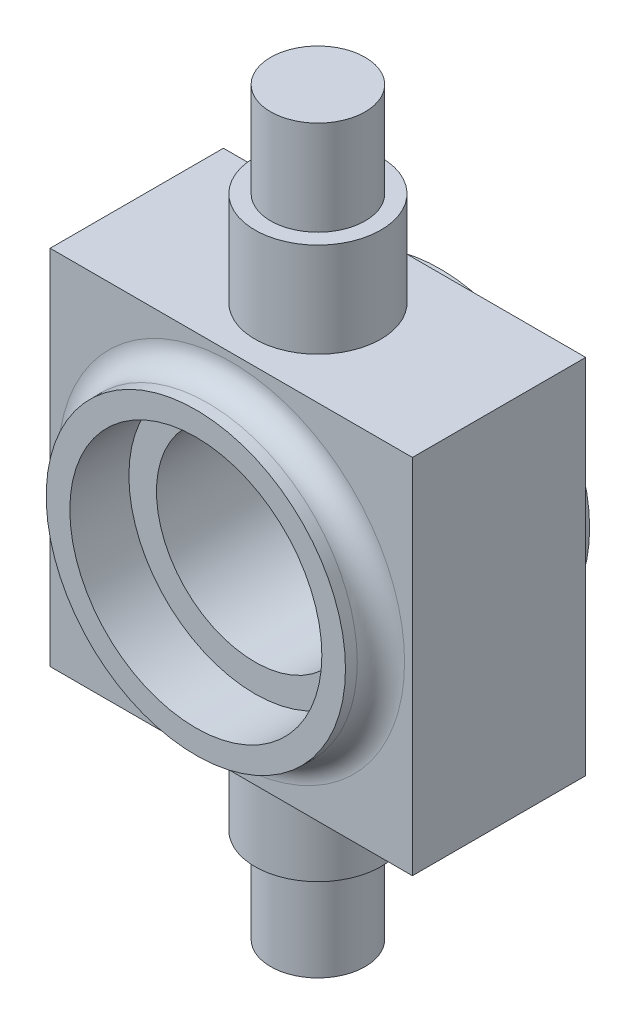
ISO-10303-21;
HEADER;
FILE_DESCRIPTION(('STEP AP214'),'2;1');
FILE_NAME('part.step','',(''),(''),'','','');
FILE_SCHEMA(('AUTOMOTIVE_DESIGN { 1 0 10303 214 1 1 1 1 }'));
ENDSEC;
DATA;
#1=APPLICATION_CONTEXT('core data for automotive mechanical design processes');
#2=APPLICATION_PROTOCOL_DEFINITION('international standard','automotive_design',2000,#1);
#3=PRODUCT_CONTEXT('',#1,'mechanical');
#4=PRODUCT('Part','Part','',(#3));
#5=PRODUCT_RELATED_PRODUCT_CATEGORY('part','',(#4));
#6=PRODUCT_DEFINITION_FORMATION('','',#4);
#7=PRODUCT_DEFINITION_CONTEXT('part definition',#1,'design');
#8=PRODUCT_DEFINITION('design','',#6,#7);
#9=PRODUCT_DEFINITION_SHAPE('','',#8);
#10=(LENGTH_UNIT() NAMED_UNIT(*) SI_UNIT(.MILLI.,.METRE.));
#11=(NAMED_UNIT(*) PLANE_ANGLE_UNIT() SI_UNIT($,.RADIAN.));
#12=(NAMED_UNIT(*) SI_UNIT($,.STERADIAN.) SOLID_ANGLE_UNIT());
#13=UNCERTAINTY_MEASURE_WITH_UNIT(LENGTH_MEASURE(1.E-05),#10,'distance_accuracy_value','');
#14=(GEOMETRIC_REPRESENTATION_CONTEXT(3) GLOBAL_UNCERTAINTY_ASSIGNED_CONTEXT((#13)) GLOBAL_UNIT_ASSIGNED_CONTEXT((#10,
#11,#12)) REPRESENTATION_CONTEXT('',''));
#15=CARTESIAN_POINT('',(0.,0.,0.));
#16=DIRECTION('',(0.,0.,1.));
#17=DIRECTION('',(1.,0.,0.));
#18=AXIS2_PLACEMENT_3D('',#15,#16,#17);
#19=CARTESIAN_POINT('',(0.,0.,-11.));
#20=DIRECTION('',(0.,0.,1.));
#21=DIRECTION('',(1.,0.,0.));
#22=AXIS2_PLACEMENT_3D('',#19,#20,#21);
#23=CYLINDRICAL_SURFACE('',#22,12.5);
#24=CARTESIAN_POINT('',(0.,0.,8.));
#25=DIRECTION('',(0.,0.,1.));
#26=DIRECTION('',(1.,0.,0.));
#27=AXIS2_PLACEMENT_3D('',#24,#25,#26);
#28=CIRCLE('',#27,12.5);
#29=CARTESIAN_POINT('',(12.5,0.,8.));
#30=VERTEX_POINT('',#29);
#31=EDGE_CURVE('E910',#30,#30,#28,.T.);
#32=ORIENTED_EDGE('',*,*,#31,.T.);
#33=EDGE_LOOP('',(#32));
#34=FACE_BOUND('',#33,.T.);
#35=CARTESIAN_POINT('',(0.,0.,-8.));
#36=DIRECTION('',(0.,0.,-1.));
#37=DIRECTION('',(-1.,0.,0.));
#38=AXIS2_PLACEMENT_3D('',#35,#36,#37);
#39=CIRCLE('',#38,12.5);
#40=CARTESIAN_POINT('',(-12.5,0.,-8.));
#41=VERTEX_POINT('',#40);
#42=EDGE_CURVE('E776',#41,#41,#39,.F.);
#43=ORIENTED_EDGE('',*,*,#42,.F.);
#44=EDGE_LOOP('',(#43));
#45=FACE_BOUND('',#44,.T.);
#46=ADVANCED_FACE('F688',(#34,#45),#23,.F.);
#47=CARTESIAN_POINT('',(23.,23.,11.));
#48=DIRECTION('',(-1.,0.,0.));
#49=DIRECTION('',(0.,-1.,0.));
#50=AXIS2_PLACEMENT_3D('',#47,#48,#49);
#51=PLANE('',#50);
#52=DIRECTION('',(0.,1.,0.));
#53=VECTOR('',#52,1.);
#54=CARTESIAN_POINT('',(23.,23.,-11.));
#55=LINE('',#54,#53);
#56=CARTESIAN_POINT('',(23.,-23.,-11.));
#57=VERTEX_POINT('',#56);
#58=CARTESIAN_POINT('',(23.,23.,-11.));
#59=VERTEX_POINT('',#58);
#60=EDGE_CURVE('E761',#57,#59,#55,.T.);
#61=ORIENTED_EDGE('',*,*,#60,.T.);
#62=DIRECTION('',(0.,0.,-1.));
#63=VECTOR('',#62,1.);
#64=CARTESIAN_POINT('',(23.,23.,11.));
#65=LINE('',#64,#63);
#66=CARTESIAN_POINT('',(23.,23.,11.));
#67=VERTEX_POINT('',#66);
#68=EDGE_CURVE('E750',#67,#59,#65,.T.);
#69=ORIENTED_EDGE('',*,*,#68,.F.);
#70=DIRECTION('',(0.,1.,0.));
#71=VECTOR('',#70,1.);
#72=CARTESIAN_POINT('',(23.,23.,11.));
#73=LINE('',#72,#71);
#74=CARTESIAN_POINT('',(23.,-23.,11.));
#75=VERTEX_POINT('',#74);
#76=EDGE_CURVE('E744',#75,#67,#73,.T.);
#77=ORIENTED_EDGE('',*,*,#76,.F.);
#78=DIRECTION('',(0.,0.,-1.));
#79=VECTOR('',#78,1.);
#80=CARTESIAN_POINT('',(23.,-23.,11.));
#81=LINE('',#80,#79);
#82=EDGE_CURVE('E760',#75,#57,#81,.T.);
#83=ORIENTED_EDGE('',*,*,#82,.T.);
#84=EDGE_LOOP('',(#61,#69,#77,#83));
#85=FACE_BOUND('',#84,.T.);
#86=ADVANCED_FACE('F821',(#85),#51,.F.);
#87=CARTESIAN_POINT('',(-23.,23.,11.));
#88=DIRECTION('',(0.,-1.,0.));
#89=DIRECTION('',(0.,0.,-1.));
#90=AXIS2_PLACEMENT_3D('',#87,#88,#89);
#91=PLANE('',#90);
#92=CARTESIAN_POINT('',(0.,23.,0.));
#93=DIRECTION('',(0.,-1.,0.));
#94=DIRECTION('',(0.,0.,-1.));
#95=AXIS2_PLACEMENT_3D('',#92,#93,#94);
#96=CIRCLE('',#95,8.);
#97=CARTESIAN_POINT('',(0.,23.,-8.));
#98=VERTEX_POINT('',#97);
#99=EDGE_CURVE('E863',#98,#98,#96,.T.);
#100=ORIENTED_EDGE('',*,*,#99,.T.);
#101=EDGE_LOOP('',(#100));
#102=FACE_BOUND('',#101,.T.);
#103=DIRECTION('',(-1.,0.,0.));
#104=VECTOR('',#103,1.);
#105=CARTESIAN_POINT('',(-23.,23.,-11.));
#106=LINE('',#105,#104);
#107=CARTESIAN_POINT('',(-23.,23.,-11.));
#108=VERTEX_POINT('',#107);
#109=EDGE_CURVE('E747',#59,#108,#106,.T.);
#110=ORIENTED_EDGE('',*,*,#109,.T.);
#111=DIRECTION('',(0.,0.,-1.));
#112=VECTOR('',#111,1.);
#113=CARTESIAN_POINT('',(-23.,23.,11.));
#114=LINE('',#113,#112);
#115=CARTESIAN_POINT('',(-23.,23.,11.));
#116=VERTEX_POINT('',#115);
#117=EDGE_CURVE('E742',#116,#108,#114,.T.);
#118=ORIENTED_EDGE('',*,*,#117,.F.);
#119=DIRECTION('',(-1.,0.,0.));
#120=VECTOR('',#119,1.);
#121=CARTESIAN_POINT('',(-23.,23.,11.));
#122=LINE('',#121,#120);
#123=EDGE_CURVE('E739',#67,#116,#122,.T.);
#124=ORIENTED_EDGE('',*,*,#123,.F.);
#125=ORIENTED_EDGE('',*,*,#68,.T.);
#126=EDGE_LOOP('',(#110,#118,#124,#125));
#127=FACE_BOUND('',#126,.T.);
#128=ADVANCED_FACE('F748',(#102,#127),#91,.F.);
#129=CARTESIAN_POINT('',(-23.,23.,11.));
#130=DIRECTION('',(1.,0.,0.));
#131=DIRECTION('',(0.,1.,0.));
#132=AXIS2_PLACEMENT_3D('',#129,#130,#131);
#133=PLANE('',#132);
#134=DIRECTION('',(0.,-1.,0.));
#135=VECTOR('',#134,1.);
#136=CARTESIAN_POINT('',(-23.,23.,-11.));
#137=LINE('',#136,#135);
#138=CARTESIAN_POINT('',(-23.,-23.,-11.));
#139=VERTEX_POINT('',#138);
#140=EDGE_CURVE('E725',#108,#139,#137,.T.);
#141=ORIENTED_EDGE('',*,*,#140,.T.);
#142=DIRECTION('',(0.,0.,-1.));
#143=VECTOR('',#142,1.);
#144=CARTESIAN_POINT('',(-23.,-23.,11.));
#145=LINE('',#144,#143);
#146=CARTESIAN_POINT('',(-23.,-23.,11.));
#147=VERTEX_POINT('',#146);
#148=EDGE_CURVE('E749',#147,#139,#145,.T.);
#149=ORIENTED_EDGE('',*,*,#148,.F.);
#150=DIRECTION('',(0.,-1.,0.));
#151=VECTOR('',#150,1.);
#152=CARTESIAN_POINT('',(-23.,23.,11.));
#153=LINE('',#152,#151);
#154=EDGE_CURVE('E738',#116,#147,#153,.T.);
#155=ORIENTED_EDGE('',*,*,#154,.F.);
#156=ORIENTED_EDGE('',*,*,#117,.T.);
#157=EDGE_LOOP('',(#141,#149,#155,#156));
#158=FACE_BOUND('',#157,.T.);
#159=ADVANCED_FACE('F755',(#158),#133,.F.);
#160=CARTESIAN_POINT('',(-23.,-23.,11.));
#161=DIRECTION('',(0.,1.,0.));
#162=DIRECTION('',(0.,0.,1.));
#163=AXIS2_PLACEMENT_3D('',#160,#161,#162);
#164=PLANE('',#163);
#165=CARTESIAN_POINT('',(0.,-23.,0.));
#166=DIRECTION('',(0.,-1.,0.));
#167=DIRECTION('',(0.,0.,-1.));
#168=AXIS2_PLACEMENT_3D('',#165,#166,#167);
#169=CIRCLE('',#168,8.);
#170=CARTESIAN_POINT('',(0.,-23.,-8.));
#171=VERTEX_POINT('',#170);
#172=EDGE_CURVE('E779',#171,#171,#169,.T.);
#173=ORIENTED_EDGE('',*,*,#172,.F.);
#174=EDGE_LOOP('',(#173));
#175=FACE_BOUND('',#174,.T.);
#176=DIRECTION('',(1.,0.,0.));
#177=VECTOR('',#176,1.);
#178=CARTESIAN_POINT('',(-23.,-23.,-11.));
#179=LINE('',#178,#177);
#180=EDGE_CURVE('E726',#139,#57,#179,.T.);
#181=ORIENTED_EDGE('',*,*,#180,.T.);
#182=ORIENTED_EDGE('',*,*,#82,.F.);
#183=DIRECTION('',(1.,0.,0.));
#184=VECTOR('',#183,1.);
#185=CARTESIAN_POINT('',(-23.,-23.,11.));
#186=LINE('',#185,#184);
#187=EDGE_CURVE('E704',#147,#75,#186,.T.);
#188=ORIENTED_EDGE('',*,*,#187,.F.);
#189=ORIENTED_EDGE('',*,*,#148,.T.);
#190=EDGE_LOOP('',(#181,#182,#188,#189));
#191=FACE_BOUND('',#190,.T.);
#192=ADVANCED_FACE('F850',(#175,#191),#164,.F.);
#193=CARTESIAN_POINT('',(0.,0.,11.));
#194=DIRECTION('',(0.,0.,1.));
#195=DIRECTION('',(1.,0.,0.));
#196=AXIS2_PLACEMENT_3D('',#193,#194,#195);
#197=PLANE('',#196);
#198=CARTESIAN_POINT('',(0.,0.,11.));
#199=DIRECTION('',(0.,0.,1.));
#200=DIRECTION('',(1.,0.,0.));
#201=AXIS2_PLACEMENT_3D('',#198,#199,#200);
#202=CIRCLE('',#201,22.);
#203=CARTESIAN_POINT('',(22.,0.,11.));
#204=VERTEX_POINT('',#203);
#205=EDGE_CURVE('E788',#204,#204,#202,.F.);
#206=ORIENTED_EDGE('',*,*,#205,.T.);
#207=EDGE_LOOP('',(#206));
#208=FACE_BOUND('',#207,.T.);
#209=ORIENTED_EDGE('',*,*,#76,.T.);
#210=ORIENTED_EDGE('',*,*,#123,.T.);
#211=ORIENTED_EDGE('',*,*,#154,.T.);
#212=ORIENTED_EDGE('',*,*,#187,.T.);
#213=EDGE_LOOP('',(#209,#210,#211,#212));
#214=FACE_BOUND('',#213,.T.);
#215=ADVANCED_FACE('F736',(#208,#214),#197,.T.);
#216=CARTESIAN_POINT('',(0.,0.,-11.));
#217=DIRECTION('',(0.,0.,1.));
#218=DIRECTION('',(1.,0.,0.));
#219=AXIS2_PLACEMENT_3D('',#216,#217,#218);
#220=PLANE('',#219);
#221=CARTESIAN_POINT('',(0.,0.,-11.));
#222=DIRECTION('',(0.,0.,1.));
#223=DIRECTION('',(1.,0.,0.));
#224=AXIS2_PLACEMENT_3D('',#221,#222,#223);
#225=CIRCLE('',#224,22.);
#226=CARTESIAN_POINT('',(22.,0.,-11.));
#227=VERTEX_POINT('',#226);
#228=EDGE_CURVE('E795',#227,#227,#225,.T.);
#229=ORIENTED_EDGE('',*,*,#228,.T.);
#230=EDGE_LOOP('',(#229));
#231=FACE_BOUND('',#230,.T.);
#232=ORIENTED_EDGE('',*,*,#60,.F.);
#233=ORIENTED_EDGE('',*,*,#180,.F.);
#234=ORIENTED_EDGE('',*,*,#140,.F.);
#235=ORIENTED_EDGE('',*,*,#109,.F.);
#236=EDGE_LOOP('',(#232,#233,#234,#235));
#237=FACE_BOUND('',#236,.T.);
#238=ADVANCED_FACE('F841',(#231,#237),#220,.F.);
#239=CARTESIAN_POINT('',(0.,0.,8.));
#240=DIRECTION('',(0.,0.,1.));
#241=DIRECTION('',(1.,0.,0.));
#242=AXIS2_PLACEMENT_3D('',#239,#240,#241);
#243=CYLINDRICAL_SURFACE('',#242,16.);
#244=CARTESIAN_POINT('',(0.,0.,8.));
#245=DIRECTION('',(0.,0.,1.));
#246=DIRECTION('',(1.,0.,0.));
#247=AXIS2_PLACEMENT_3D('',#244,#245,#246);
#248=CIRCLE('',#247,16.);
#249=CARTESIAN_POINT('',(16.,0.,8.));
#250=VERTEX_POINT('',#249);
#251=EDGE_CURVE('E764',#250,#250,#248,.T.);
#252=ORIENTED_EDGE('',*,*,#251,.F.);
#253=EDGE_LOOP('',(#252));
#254=FACE_BOUND('',#253,.T.);
#255=CARTESIAN_POINT('',(0.,0.,15.5));
#256=DIRECTION('',(0.,0.,1.));
#257=DIRECTION('',(1.,0.,0.));
#258=AXIS2_PLACEMENT_3D('',#255,#256,#257);
#259=CIRCLE('',#258,16.);
#260=CARTESIAN_POINT('',(16.,0.,15.5));
#261=VERTEX_POINT('',#260);
#262=EDGE_CURVE('E894',#261,#261,#259,.T.);
#263=ORIENTED_EDGE('',*,*,#262,.T.);
#264=EDGE_LOOP('',(#263));
#265=FACE_BOUND('',#264,.T.);
#266=ADVANCED_FACE('F838',(#254,#265),#243,.F.);
#267=CARTESIAN_POINT('',(0.,0.,8.));
#268=DIRECTION('',(0.,0.,1.));
#269=DIRECTION('',(1.,0.,0.));
#270=AXIS2_PLACEMENT_3D('',#267,#268,#269);
#271=PLANE('',#270);
#272=ORIENTED_EDGE('',*,*,#31,.F.);
#273=EDGE_LOOP('',(#272));
#274=FACE_BOUND('',#273,.T.);
#275=ORIENTED_EDGE('',*,*,#251,.T.);
#276=EDGE_LOOP('',(#275));
#277=FACE_BOUND('',#276,.T.);
#278=ADVANCED_FACE('F840',(#274,#277),#271,.T.);
#279=CARTESIAN_POINT('',(0.,-35.,0.));
#280=DIRECTION('',(0.,1.,0.));
#281=DIRECTION('',(0.,0.,1.));
#282=AXIS2_PLACEMENT_3D('',#279,#280,#281);
#283=CYLINDRICAL_SURFACE('',#282,8.);
#284=CARTESIAN_POINT('',(0.,-35.,0.));
#285=DIRECTION('',(0.,-1.,0.));
#286=DIRECTION('',(0.,0.,-1.));
#287=AXIS2_PLACEMENT_3D('',#284,#285,#286);
#288=CIRCLE('',#287,8.);
#289=CARTESIAN_POINT('',(0.,-35.,-8.));
#290=VERTEX_POINT('',#289);
#291=EDGE_CURVE('E904',#290,#290,#288,.T.);
#292=ORIENTED_EDGE('',*,*,#291,.F.);
#293=EDGE_LOOP('',(#292));
#294=FACE_BOUND('',#293,.T.);
#295=ORIENTED_EDGE('',*,*,#172,.T.);
#296=EDGE_LOOP('',(#295));
#297=FACE_BOUND('',#296,.T.);
#298=ADVANCED_FACE('F834',(#294,#297),#283,.T.);
#299=CARTESIAN_POINT('',(0.,-35.,0.));
#300=DIRECTION('',(0.,-1.,0.));
#301=DIRECTION('',(0.,0.,-1.));
#302=AXIS2_PLACEMENT_3D('',#299,#300,#301);
#303=PLANE('',#302);
#304=CARTESIAN_POINT('',(0.,-35.,0.));
#305=DIRECTION('',(0.,-1.,0.));
#306=DIRECTION('',(0.,0.,-1.));
#307=AXIS2_PLACEMENT_3D('',#304,#305,#306);
#308=CIRCLE('',#307,6.);
#309=CARTESIAN_POINT('',(0.,-35.,-6.));
#310=VERTEX_POINT('',#309);
#311=EDGE_CURVE('E12',#310,#310,#308,.T.);
#312=ORIENTED_EDGE('',*,*,#311,.F.);
#313=EDGE_LOOP('',(#312));
#314=FACE_BOUND('',#313,.T.);
#315=ORIENTED_EDGE('',*,*,#291,.T.);
#316=EDGE_LOOP('',(#315));
#317=FACE_BOUND('',#316,.T.);
#318=ADVANCED_FACE('F943',(#314,#317),#303,.T.);
#319=CARTESIAN_POINT('',(0.,0.,15.5));
#320=DIRECTION('',(0.,0.,1.));
#321=DIRECTION('',(1.,0.,0.));
#322=AXIS2_PLACEMENT_3D('',#319,#320,#321);
#323=PLANE('',#322);
#324=ORIENTED_EDGE('',*,*,#262,.F.);
#325=EDGE_LOOP('',(#324));
#326=FACE_BOUND('',#325,.T.);
#327=CARTESIAN_POINT('',(0.,0.,15.5));
#328=DIRECTION('',(0.,0.,1.));
#329=DIRECTION('',(1.,0.,0.));
#330=AXIS2_PLACEMENT_3D('',#327,#328,#329);
#331=CIRCLE('',#330,19.);
#332=CARTESIAN_POINT('',(19.,0.,15.5));
#333=VERTEX_POINT('',#332);
#334=EDGE_CURVE('E898',#333,#333,#331,.T.);
#335=ORIENTED_EDGE('',*,*,#334,.T.);
#336=EDGE_LOOP('',(#335));
#337=FACE_BOUND('',#336,.T.);
#338=ADVANCED_FACE('F940',(#326,#337),#323,.T.);
#339=CARTESIAN_POINT('',(0.,0.,15.5));
#340=DIRECTION('',(0.,0.,-1.));
#341=DIRECTION('',(-1.,0.,0.));
#342=AXIS2_PLACEMENT_3D('',#339,#340,#341);
#343=CYLINDRICAL_SURFACE('',#342,19.);
#344=CARTESIAN_POINT('',(0.,0.,14.));
#345=DIRECTION('',(0.,0.,1.));
#346=DIRECTION('',(1.,0.,0.));
#347=AXIS2_PLACEMENT_3D('',#344,#345,#346);
#348=CIRCLE('',#347,19.);
#349=CARTESIAN_POINT('',(19.,0.,14.));
#350=VERTEX_POINT('',#349);
#351=EDGE_CURVE('E782',#350,#350,#348,.T.);
#352=ORIENTED_EDGE('',*,*,#351,.T.);
#353=EDGE_LOOP('',(#352));
#354=FACE_BOUND('',#353,.T.);
#355=ORIENTED_EDGE('',*,*,#334,.F.);
#356=EDGE_LOOP('',(#355));
#357=FACE_BOUND('',#356,.T.);
#358=ADVANCED_FACE('F937',(#354,#357),#343,.T.);
#359=CARTESIAN_POINT('',(0.,0.,-15.5));
#360=DIRECTION('',(0.,0.,-1.));
#361=DIRECTION('',(1.,0.,0.));
#362=AXIS2_PLACEMENT_3D('',#359,#360,#361);
#363=PLANE('',#362);
#364=CARTESIAN_POINT('',(0.,0.,-15.5));
#365=DIRECTION('',(0.,0.,1.));
#366=DIRECTION('',(1.,0.,0.));
#367=AXIS2_PLACEMENT_3D('',#364,#365,#366);
#368=CIRCLE('',#367,16.);
#369=CARTESIAN_POINT('',(16.,0.,-15.5));
#370=VERTEX_POINT('',#369);
#371=EDGE_CURVE('E884',#370,#370,#368,.T.);
#372=ORIENTED_EDGE('',*,*,#371,.T.);
#373=EDGE_LOOP('',(#372));
#374=FACE_BOUND('',#373,.T.);
#375=CARTESIAN_POINT('',(0.,0.,-15.5));
#376=DIRECTION('',(0.,0.,1.));
#377=DIRECTION('',(1.,0.,0.));
#378=AXIS2_PLACEMENT_3D('',#375,#376,#377);
#379=CIRCLE('',#378,19.);
#380=CARTESIAN_POINT('',(19.,0.,-15.5));
#381=VERTEX_POINT('',#380);
#382=EDGE_CURVE('E785',#381,#381,#379,.T.);
#383=ORIENTED_EDGE('',*,*,#382,.F.);
#384=EDGE_LOOP('',(#383));
#385=FACE_BOUND('',#384,.T.);
#386=ADVANCED_FACE('F948',(#374,#385),#363,.T.);
#387=CARTESIAN_POINT('',(0.,0.,-15.5));
#388=DIRECTION('',(0.,0.,1.));
#389=DIRECTION('',(1.,0.,0.));
#390=AXIS2_PLACEMENT_3D('',#387,#388,#389);
#391=CYLINDRICAL_SURFACE('',#390,19.);
#392=CARTESIAN_POINT('',(0.,0.,-14.));
#393=DIRECTION('',(0.,0.,1.));
#394=DIRECTION('',(1.,0.,0.));
#395=AXIS2_PLACEMENT_3D('',#392,#393,#394);
#396=CIRCLE('',#395,19.);
#397=CARTESIAN_POINT('',(19.,0.,-14.));
#398=VERTEX_POINT('',#397);
#399=EDGE_CURVE('E687',#398,#398,#396,.F.);
#400=ORIENTED_EDGE('',*,*,#399,.T.);
#401=EDGE_LOOP('',(#400));
#402=FACE_BOUND('',#401,.T.);
#403=ORIENTED_EDGE('',*,*,#382,.T.);
#404=EDGE_LOOP('',(#403));
#405=FACE_BOUND('',#404,.T.);
#406=ADVANCED_FACE('F805',(#402,#405),#391,.T.);
#407=CARTESIAN_POINT('',(0.,0.,-8.));
#408=DIRECTION('',(0.,0.,-1.));
#409=DIRECTION('',(1.,0.,0.));
#410=AXIS2_PLACEMENT_3D('',#407,#408,#409);
#411=PLANE('',#410);
#412=CARTESIAN_POINT('',(0.,0.,-8.));
#413=DIRECTION('',(0.,0.,1.));
#414=DIRECTION('',(1.,0.,0.));
#415=AXIS2_PLACEMENT_3D('',#412,#413,#414);
#416=CIRCLE('',#415,16.);
#417=CARTESIAN_POINT('',(16.,0.,-8.));
#418=VERTEX_POINT('',#417);
#419=EDGE_CURVE('E783',#418,#418,#416,.T.);
#420=ORIENTED_EDGE('',*,*,#419,.F.);
#421=EDGE_LOOP('',(#420));
#422=FACE_BOUND('',#421,.T.);
#423=ORIENTED_EDGE('',*,*,#42,.T.);
#424=EDGE_LOOP('',(#423));
#425=FACE_BOUND('',#424,.T.);
#426=ADVANCED_FACE('F1004',(#422,#425),#411,.T.);
#427=CARTESIAN_POINT('',(0.,0.,-8.));
#428=DIRECTION('',(0.,0.,-1.));
#429=DIRECTION('',(-1.,0.,0.));
#430=AXIS2_PLACEMENT_3D('',#427,#428,#429);
#431=CYLINDRICAL_SURFACE('',#430,16.);
#432=ORIENTED_EDGE('',*,*,#419,.T.);
#433=EDGE_LOOP('',(#432));
#434=FACE_BOUND('',#433,.T.);
#435=ORIENTED_EDGE('',*,*,#371,.F.);
#436=EDGE_LOOP('',(#435));
#437=FACE_BOUND('',#436,.T.);
#438=ADVANCED_FACE('F816',(#434,#437),#431,.F.);
#439=CARTESIAN_POINT('',(0.,0.,14.));
#440=DIRECTION('',(0.,0.,1.));
#441=DIRECTION('',(1.,0.,0.));
#442=AXIS2_PLACEMENT_3D('',#439,#440,#441);
#443=TOROIDAL_SURFACE('',#442,22.,3.);
#444=ORIENTED_EDGE('',*,*,#205,.F.);
#445=EDGE_LOOP('',(#444));
#446=FACE_BOUND('',#445,.T.);
#447=ORIENTED_EDGE('',*,*,#351,.F.);
#448=EDGE_LOOP('',(#447));
#449=FACE_BOUND('',#448,.T.);
#450=ADVANCED_FACE('F808',(#446,#449),#443,.F.);
#451=CARTESIAN_POINT('',(0.,0.,-14.));
#452=DIRECTION('',(0.,0.,1.));
#453=DIRECTION('',(1.,0.,0.));
#454=AXIS2_PLACEMENT_3D('',#451,#452,#453);
#455=TOROIDAL_SURFACE('',#454,22.,3.);
#456=ORIENTED_EDGE('',*,*,#399,.F.);
#457=EDGE_LOOP('',(#456));
#458=FACE_BOUND('',#457,.T.);
#459=ORIENTED_EDGE('',*,*,#228,.F.);
#460=EDGE_LOOP('',(#459));
#461=FACE_BOUND('',#460,.T.);
#462=ADVANCED_FACE('F686',(#458,#461),#455,.F.);
#463=CARTESIAN_POINT('',(0.,-47.,0.));
#464=DIRECTION('',(0.,1.,0.));
#465=DIRECTION('',(0.,0.,1.));
#466=AXIS2_PLACEMENT_3D('',#463,#464,#465);
#467=CYLINDRICAL_SURFACE('',#466,6.);
#468=CARTESIAN_POINT('',(0.,-47.,0.));
#469=DIRECTION('',(0.,-1.,0.));
#470=DIRECTION('',(0.,0.,-1.));
#471=AXIS2_PLACEMENT_3D('',#468,#469,#470);
#472=CIRCLE('',#471,6.);
#473=CARTESIAN_POINT('',(0.,-47.,-6.));
#474=VERTEX_POINT('',#473);
#475=EDGE_CURVE('E872',#474,#474,#472,.T.);
#476=ORIENTED_EDGE('',*,*,#475,.F.);
#477=EDGE_LOOP('',(#476));
#478=FACE_BOUND('',#477,.T.);
#479=ORIENTED_EDGE('',*,*,#311,.T.);
#480=EDGE_LOOP('',(#479));
#481=FACE_BOUND('',#480,.T.);
#482=ADVANCED_FACE('F810',(#478,#481),#467,.T.);
#483=CARTESIAN_POINT('',(0.,-47.,0.));
#484=DIRECTION('',(0.,-1.,0.));
#485=DIRECTION('',(0.,0.,-1.));
#486=AXIS2_PLACEMENT_3D('',#483,#484,#485);
#487=PLANE('',#486);
#488=ORIENTED_EDGE('',*,*,#475,.T.);
#489=EDGE_LOOP('',(#488));
#490=FACE_BOUND('',#489,.T.);
#491=ADVANCED_FACE('F814',(#490),#487,.T.);
#492=CARTESIAN_POINT('',(0.,35.,0.));
#493=DIRECTION('',(0.,-1.,0.));
#494=DIRECTION('',(0.,0.,-1.));
#495=AXIS2_PLACEMENT_3D('',#492,#493,#494);
#496=CYLINDRICAL_SURFACE('',#495,8.);
#497=CARTESIAN_POINT('',(0.,35.,0.));
#498=DIRECTION('',(0.,-1.,0.));
#499=DIRECTION('',(0.,0.,-1.));
#500=AXIS2_PLACEMENT_3D('',#497,#498,#499);
#501=CIRCLE('',#500,8.);
#502=CARTESIAN_POINT('',(0.,35.,-8.));
#503=VERTEX_POINT('',#502);
#504=EDGE_CURVE('E870',#503,#503,#501,.T.);
#505=ORIENTED_EDGE('',*,*,#504,.T.);
#506=EDGE_LOOP('',(#505));
#507=FACE_BOUND('',#506,.T.);
#508=ORIENTED_EDGE('',*,*,#99,.F.);
#509=EDGE_LOOP('',(#508));
#510=FACE_BOUND('',#509,.T.);
#511=ADVANCED_FACE('F1045',(#507,#510),#496,.T.);
#512=CARTESIAN_POINT('',(0.,35.,0.));
#513=DIRECTION('',(0.,1.,0.));
#514=DIRECTION('',(0.,0.,-1.));
#515=AXIS2_PLACEMENT_3D('',#512,#513,#514);
#516=PLANE('',#515);
#517=CARTESIAN_POINT('',(0.,35.,0.));
#518=DIRECTION('',(0.,-1.,0.));
#519=DIRECTION('',(0.,0.,-1.));
#520=AXIS2_PLACEMENT_3D('',#517,#518,#519);
#521=CIRCLE('',#520,6.);
#522=CARTESIAN_POINT('',(0.,35.,-6.));
#523=VERTEX_POINT('',#522);
#524=EDGE_CURVE('E876',#523,#523,#521,.T.);
#525=ORIENTED_EDGE('',*,*,#524,.T.);
#526=EDGE_LOOP('',(#525));
#527=FACE_BOUND('',#526,.T.);
#528=ORIENTED_EDGE('',*,*,#504,.F.);
#529=EDGE_LOOP('',(#528));
#530=FACE_BOUND('',#529,.T.);
#531=ADVANCED_FACE('F1052',(#527,#530),#516,.T.);
#532=CARTESIAN_POINT('',(0.,47.,0.));
#533=DIRECTION('',(0.,-1.,0.));
#534=DIRECTION('',(0.,0.,-1.));
#535=AXIS2_PLACEMENT_3D('',#532,#533,#534);
#536=CYLINDRICAL_SURFACE('',#535,6.);
#537=CARTESIAN_POINT('',(0.,47.,0.));
#538=DIRECTION('',(0.,-1.,0.));
#539=DIRECTION('',(0.,0.,-1.));
#540=AXIS2_PLACEMENT_3D('',#537,#538,#539);
#541=CIRCLE('',#540,6.);
#542=CARTESIAN_POINT('',(0.,47.,-6.));
#543=VERTEX_POINT('',#542);
#544=EDGE_CURVE('E868',#543,#543,#541,.T.);
#545=ORIENTED_EDGE('',*,*,#544,.T.);
#546=EDGE_LOOP('',(#545));
#547=FACE_BOUND('',#546,.T.);
#548=ORIENTED_EDGE('',*,*,#524,.F.);
#549=EDGE_LOOP('',(#548));
#550=FACE_BOUND('',#549,.T.);
#551=ADVANCED_FACE('F1058',(#547,#550),#536,.T.);
#552=CARTESIAN_POINT('',(0.,47.,0.));
#553=DIRECTION('',(0.,1.,0.));
#554=DIRECTION('',(0.,0.,-1.));
#555=AXIS2_PLACEMENT_3D('',#552,#553,#554);
#556=PLANE('',#555);
#557=ORIENTED_EDGE('',*,*,#544,.F.);
#558=EDGE_LOOP('',(#557));
#559=FACE_BOUND('',#558,.T.);
#560=ADVANCED_FACE('F1068',(#559),#556,.T.);
#561=CLOSED_SHELL('',(#46,#86,#128,#159,#192,#215,#238,#266,#278,#298,#318,#338,#358,#386,#406,
#426,#438,#450,#462,#482,#491,#511,#531,#551,#560));
#562=MANIFOLD_SOLID_BREP('B2',#561);
#563=ADVANCED_BREP_SHAPE_REPRESENTATION('',(#18,#562),#14);
#564=SHAPE_DEFINITION_REPRESENTATION(#9,#563);
ENDSEC;
END-ISO-10303-21;
